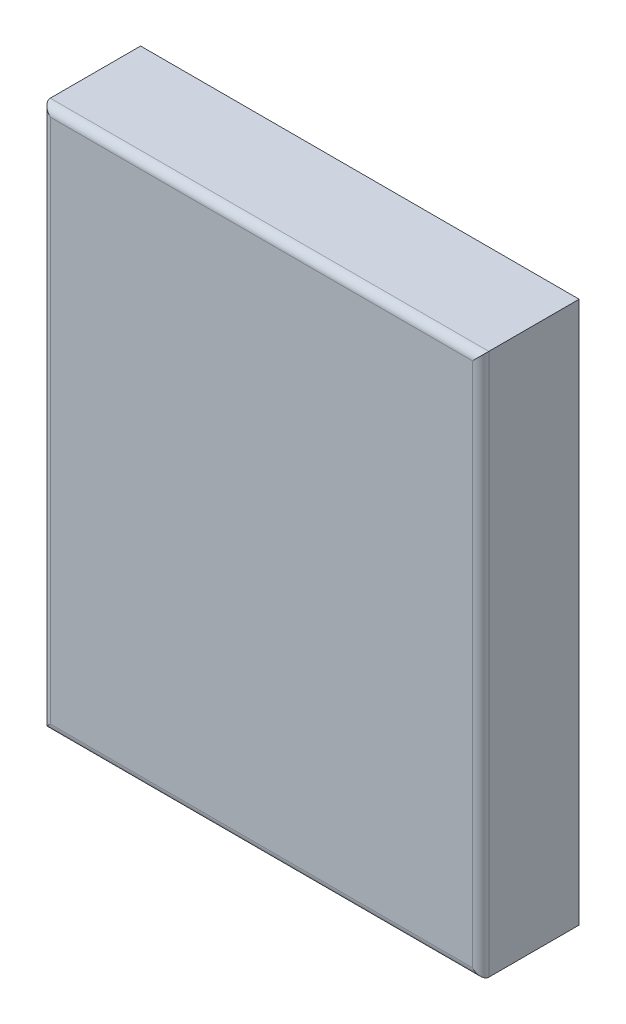
ISO-10303-21;
HEADER;
FILE_DESCRIPTION(('STEP AP214'),'2;1');
FILE_NAME('part.step','',(''),(''),'','','');
FILE_SCHEMA(('AUTOMOTIVE_DESIGN { 1 0 10303 214 1 1 1 1 }'));
ENDSEC;
DATA;
#1=APPLICATION_CONTEXT('core data for automotive mechanical design processes');
#2=APPLICATION_PROTOCOL_DEFINITION('international standard','automotive_design',2000,#1);
#3=PRODUCT_CONTEXT('',#1,'mechanical');
#4=PRODUCT('Part','Part','',(#3));
#5=PRODUCT_RELATED_PRODUCT_CATEGORY('part','',(#4));
#6=PRODUCT_DEFINITION_FORMATION('','',#4);
#7=PRODUCT_DEFINITION_CONTEXT('part definition',#1,'design');
#8=PRODUCT_DEFINITION('design','',#6,#7);
#9=PRODUCT_DEFINITION_SHAPE('','',#8);
#10=(LENGTH_UNIT() NAMED_UNIT(*) SI_UNIT(.MILLI.,.METRE.));
#11=(NAMED_UNIT(*) PLANE_ANGLE_UNIT() SI_UNIT($,.RADIAN.));
#12=(NAMED_UNIT(*) SI_UNIT($,.STERADIAN.) SOLID_ANGLE_UNIT());
#13=UNCERTAINTY_MEASURE_WITH_UNIT(LENGTH_MEASURE(1.E-05),#10,'distance_accuracy_value','');
#14=(GEOMETRIC_REPRESENTATION_CONTEXT(3) GLOBAL_UNCERTAINTY_ASSIGNED_CONTEXT((#13)) GLOBAL_UNIT_ASSIGNED_CONTEXT((#10,
#11,#12)) REPRESENTATION_CONTEXT('',''));
#15=CARTESIAN_POINT('',(0.,0.,0.));
#16=DIRECTION('',(0.,0.,1.));
#17=DIRECTION('',(1.,0.,0.));
#18=AXIS2_PLACEMENT_3D('',#15,#16,#17);
#19=CARTESIAN_POINT('',(55.00000122,70.5000006,3.));
#20=DIRECTION('',(0.,0.,-1.));
#21=DIRECTION('',(-1.,0.,0.));
#22=AXIS2_PLACEMENT_3D('',#19,#20,#21);
#23=PLANE('',#22);
#24=DIRECTION('',(-1.19248806385E-08,1.,0.));
#25=VECTOR('',#24,1.);
#26=CARTESIAN_POINT('',(53.7150012396762,68.850000584677,3.));
#27=LINE('',#26,#25);
#28=CARTESIAN_POINT('',(53.7150012390795,68.9000005846766,3.));
#29=VERTEX_POINT('',#28);
#30=CARTESIAN_POINT('',(53.7150012009199,72.1000005846765,3.));
#31=VERTEX_POINT('',#30);
#32=EDGE_CURVE('E87',#29,#31,#27,.T.);
#33=ORIENTED_EDGE('',*,*,#32,.F.);
#34=DIRECTION('',(-1.,-1.19248806385E-08,0.));
#35=VECTOR('',#34,1.);
#36=CARTESIAN_POINT('',(56.33500123908,68.9000006159192,3.));
#37=LINE('',#36,#35);
#38=CARTESIAN_POINT('',(56.2850012390801,68.9000006153235,3.));
#39=VERTEX_POINT('',#38);
#40=EDGE_CURVE('E79',#39,#29,#37,.T.);
#41=ORIENTED_EDGE('',*,*,#40,.F.);
#42=DIRECTION('',(1.19248806385E-08,-1.,0.));
#43=VECTOR('',#42,1.);
#44=CARTESIAN_POINT('',(56.2850012003238,72.150000615323,3.));
#45=LINE('',#44,#43);
#46=CARTESIAN_POINT('',(56.2850012009205,72.1000006153235,3.));
#47=VERTEX_POINT('',#46);
#48=EDGE_CURVE('E76',#47,#39,#45,.T.);
#49=ORIENTED_EDGE('',*,*,#48,.F.);
#50=DIRECTION('',(1.,1.19248806385E-08,0.));
#51=VECTOR('',#50,1.);
#52=CARTESIAN_POINT('',(53.66500120092,72.1000005840808,3.));
#53=LINE('',#52,#51);
#54=EDGE_CURVE('E67',#31,#47,#53,.T.);
#55=ORIENTED_EDGE('',*,*,#54,.F.);
#56=EDGE_LOOP('',(#33,#41,#49,#55));
#57=FACE_BOUND('',#56,.T.);
#58=ADVANCED_FACE('F17',(#57),#23,.F.);
#59=CARTESIAN_POINT('',(56.285001200324,72.150000615323,2.95));
#60=DIRECTION('',(1.19248806385E-08,-1.,0.));
#61=DIRECTION('',(1.,1.19248806385E-08,0.));
#62=AXIS2_PLACEMENT_3D('',#59,#60,#61);
#63=CYLINDRICAL_SURFACE('',#62,0.05);
#64=CARTESIAN_POINT('',(56.2850012390799,68.9000006153238,2.95));
#65=DIRECTION('',(-0.707106772754383,-0.707106789618711,0.));
#66=DIRECTION('',(-0.707106789618711,0.707106772754383,0.));
#67=AXIS2_PLACEMENT_3D('',#64,#65,#66);
#68=ELLIPSE('',#67,0.0707106781186548,0.05);
#69=CARTESIAN_POINT('',(56.3350012396761,68.85000061592,2.95));
#70=VERTEX_POINT('',#69);
#71=EDGE_CURVE('E91',#70,#39,#68,.T.);
#72=ORIENTED_EDGE('',*,*,#71,.F.);
#73=DIRECTION('',(-1.19248806385E-08,1.,0.));
#74=VECTOR('',#73,1.);
#75=CARTESIAN_POINT('',(56.335001200324,72.15000061592,2.95));
#76=LINE('',#75,#74);
#77=CARTESIAN_POINT('',(56.335001200324,72.1500006159194,2.95));
#78=VERTEX_POINT('',#77);
#79=EDGE_CURVE('E85',#78,#70,#76,.F.);
#80=ORIENTED_EDGE('',*,*,#79,.F.);
#81=CARTESIAN_POINT('',(56.2850012009202,72.1000006153232,2.95));
#82=DIRECTION('',(0.707106789618711,-0.707106772754383,0.));
#83=DIRECTION('',(0.707106772754383,0.707106789618711,0.));
#84=AXIS2_PLACEMENT_3D('',#81,#82,#83);
#85=ELLIPSE('',#84,0.0707106781186548,0.05);
#86=EDGE_CURVE('E20',#47,#78,#85,.F.);
#87=ORIENTED_EDGE('',*,*,#86,.F.);
#88=ORIENTED_EDGE('',*,*,#48,.T.);
#89=EDGE_LOOP('',(#72,#80,#87,#88));
#90=FACE_BOUND('',#89,.T.);
#91=ADVANCED_FACE('F84',(#90),#63,.T.);
#92=CARTESIAN_POINT('',(53.66500120092,72.10000058408,2.95));
#93=DIRECTION('',(1.,1.19248806385E-08,0.));
#94=DIRECTION('',(-1.19248806385E-08,1.,0.));
#95=AXIS2_PLACEMENT_3D('',#92,#93,#94);
#96=CYLINDRICAL_SURFACE('',#95,0.05);
#97=DIRECTION('',(-1.,-1.19248806385E-08,0.));
#98=VECTOR('',#97,1.);
#99=CARTESIAN_POINT('',(53.665001200324,72.15000058408,2.95));
#100=LINE('',#99,#98);
#101=CARTESIAN_POINT('',(53.6650012003239,72.15000058408,2.95));
#102=VERTEX_POINT('',#101);
#103=EDGE_CURVE('E99',#102,#78,#100,.F.);
#104=ORIENTED_EDGE('',*,*,#103,.F.);
#105=CARTESIAN_POINT('',(53.7150012009201,72.1000005846762,2.95));
#106=DIRECTION('',(0.707106772754383,0.707106789618711,0.));
#107=DIRECTION('',(-0.707106789618711,0.707106772754383,0.));
#108=AXIS2_PLACEMENT_3D('',#105,#106,#107);
#109=ELLIPSE('',#108,0.0707106781186548,0.05);
#110=EDGE_CURVE('E73',#31,#102,#109,.F.);
#111=ORIENTED_EDGE('',*,*,#110,.F.);
#112=ORIENTED_EDGE('',*,*,#54,.T.);
#113=ORIENTED_EDGE('',*,*,#86,.T.);
#114=EDGE_LOOP('',(#104,#111,#112,#113));
#115=FACE_BOUND('',#114,.T.);
#116=ADVANCED_FACE('F70',(#115),#96,.T.);
#117=CARTESIAN_POINT('',(53.715001239676,68.850000584677,2.95));
#118=DIRECTION('',(-1.19248806385E-08,1.,0.));
#119=DIRECTION('',(-1.,-1.19248806385E-08,0.));
#120=AXIS2_PLACEMENT_3D('',#117,#118,#119);
#121=CYLINDRICAL_SURFACE('',#120,0.05);
#122=DIRECTION('',(1.19248806385E-08,-1.,0.));
#123=VECTOR('',#122,1.);
#124=CARTESIAN_POINT('',(53.665001239676,68.85000058408,2.95));
#125=LINE('',#124,#123);
#126=CARTESIAN_POINT('',(53.665001239676,68.8500005840806,2.95));
#127=VERTEX_POINT('',#126);
#128=EDGE_CURVE('E98',#127,#102,#125,.F.);
#129=ORIENTED_EDGE('',*,*,#128,.F.);
#130=CARTESIAN_POINT('',(53.7150012390798,68.9000005846768,2.95));
#131=DIRECTION('',(-0.707106789618711,0.707106772754383,0.));
#132=DIRECTION('',(-0.707106772754383,-0.707106789618711,0.));
#133=AXIS2_PLACEMENT_3D('',#130,#131,#132);
#134=ELLIPSE('',#133,0.0707106781186548,0.05);
#135=EDGE_CURVE('E113',#29,#127,#134,.F.);
#136=ORIENTED_EDGE('',*,*,#135,.F.);
#137=ORIENTED_EDGE('',*,*,#32,.T.);
#138=ORIENTED_EDGE('',*,*,#110,.T.);
#139=EDGE_LOOP('',(#129,#136,#137,#138));
#140=FACE_BOUND('',#139,.T.);
#141=ADVANCED_FACE('F170',(#140),#121,.T.);
#142=CARTESIAN_POINT('',(56.33500123908,68.90000061592,2.95));
#143=DIRECTION('',(-1.,-1.19248806385E-08,0.));
#144=DIRECTION('',(1.19248806385E-08,-1.,0.));
#145=AXIS2_PLACEMENT_3D('',#142,#143,#144);
#146=CYLINDRICAL_SURFACE('',#145,0.05);
#147=ORIENTED_EDGE('',*,*,#135,.T.);
#148=DIRECTION('',(1.,1.19248806385E-08,0.));
#149=VECTOR('',#148,1.);
#150=CARTESIAN_POINT('',(56.335001239676,68.85000061592,2.95));
#151=LINE('',#150,#149);
#152=EDGE_CURVE('E122',#70,#127,#151,.F.);
#153=ORIENTED_EDGE('',*,*,#152,.F.);
#154=ORIENTED_EDGE('',*,*,#71,.T.);
#155=ORIENTED_EDGE('',*,*,#40,.T.);
#156=EDGE_LOOP('',(#147,#153,#154,#155));
#157=FACE_BOUND('',#156,.T.);
#158=ADVANCED_FACE('F167',(#157),#146,.T.);
#159=CARTESIAN_POINT('',(56.335001200324,72.15000061592,0.));
#160=DIRECTION('',(1.,1.19248806385E-08,0.));
#161=DIRECTION('',(-1.19248806385E-08,1.,0.));
#162=AXIS2_PLACEMENT_3D('',#159,#160,#161);
#163=PLANE('',#162);
#164=DIRECTION('',(0.,0.,1.));
#165=VECTOR('',#164,1.);
#166=CARTESIAN_POINT('',(56.335001200324,72.1500006159195,0.));
#167=LINE('',#166,#165);
#168=CARTESIAN_POINT('',(56.3350012167207,72.1500006159198,2.4));
#169=VERTEX_POINT('',#168);
#170=EDGE_CURVE('E103',#78,#169,#167,.F.);
#171=ORIENTED_EDGE('',*,*,#170,.F.);
#172=ORIENTED_EDGE('',*,*,#79,.T.);
#173=DIRECTION('',(0.,0.,1.));
#174=VECTOR('',#173,1.);
#175=CARTESIAN_POINT('',(56.335001239676,68.85000061592,0.));
#176=LINE('',#175,#174);
#177=CARTESIAN_POINT('',(56.335001239676,68.85000061592,2.4));
#178=VERTEX_POINT('',#177);
#179=EDGE_CURVE('E119',#178,#70,#176,.T.);
#180=ORIENTED_EDGE('',*,*,#179,.F.);
#181=DIRECTION('',(0.,1.,0.));
#182=VECTOR('',#181,1.);
#183=CARTESIAN_POINT('',(56.335001239676,72.390000643705,2.4));
#184=LINE('',#183,#182);
#185=EDGE_CURVE('E107',#178,#169,#184,.T.);
#186=ORIENTED_EDGE('',*,*,#185,.T.);
#187=EDGE_LOOP('',(#171,#172,#180,#186));
#188=FACE_BOUND('',#187,.T.);
#189=ADVANCED_FACE('F150',(#188),#163,.T.);
#190=CARTESIAN_POINT('',(53.665001200324,72.15000058408,0.));
#191=DIRECTION('',(-1.19248806385E-08,1.,0.));
#192=DIRECTION('',(-1.,-1.19248806385E-08,0.));
#193=AXIS2_PLACEMENT_3D('',#190,#191,#192);
#194=PLANE('',#193);
#195=DIRECTION('',(0.,0.,1.));
#196=VECTOR('',#195,1.);
#197=CARTESIAN_POINT('',(53.6650012003239,72.15000058408,0.));
#198=LINE('',#197,#196);
#199=CARTESIAN_POINT('',(53.6650012003239,72.15000058806,2.4));
#200=VERTEX_POINT('',#199);
#201=EDGE_CURVE('E96',#102,#200,#198,.F.);
#202=ORIENTED_EDGE('',*,*,#201,.F.);
#203=ORIENTED_EDGE('',*,*,#103,.T.);
#204=ORIENTED_EDGE('',*,*,#170,.T.);
#205=DIRECTION('',(1.,0.,0.));
#206=VECTOR('',#205,1.);
#207=CARTESIAN_POINT('',(58.665001197462,72.15000061592,2.4));
#208=LINE('',#207,#206);
#209=EDGE_CURVE('E104',#169,#200,#208,.F.);
#210=ORIENTED_EDGE('',*,*,#209,.T.);
#211=EDGE_LOOP('',(#202,#203,#204,#210));
#212=FACE_BOUND('',#211,.T.);
#213=ADVANCED_FACE('F147',(#212),#194,.T.);
#214=CARTESIAN_POINT('',(53.665001239676,68.85000058408,0.));
#215=DIRECTION('',(-1.,-1.19248806385E-08,0.));
#216=DIRECTION('',(1.19248806385E-08,-1.,0.));
#217=AXIS2_PLACEMENT_3D('',#214,#215,#216);
#218=PLANE('',#217);
#219=DIRECTION('',(0.,0.,1.));
#220=VECTOR('',#219,1.);
#221=CARTESIAN_POINT('',(53.665001239676,68.8500005840806,0.));
#222=LINE('',#221,#220);
#223=CARTESIAN_POINT('',(53.665001234757,68.8500005840803,2.4));
#224=VERTEX_POINT('',#223);
#225=EDGE_CURVE('E34',#127,#224,#222,.F.);
#226=ORIENTED_EDGE('',*,*,#225,.F.);
#227=ORIENTED_EDGE('',*,*,#128,.T.);
#228=ORIENTED_EDGE('',*,*,#201,.T.);
#229=DIRECTION('',(0.,1.,0.));
#230=VECTOR('',#229,1.);
#231=CARTESIAN_POINT('',(53.665001200324,72.390000643705,2.4));
#232=LINE('',#231,#230);
#233=EDGE_CURVE('E26',#200,#224,#232,.F.);
#234=ORIENTED_EDGE('',*,*,#233,.T.);
#235=EDGE_LOOP('',(#226,#227,#228,#234));
#236=FACE_BOUND('',#235,.T.);
#237=ADVANCED_FACE('F140',(#236),#218,.T.);
#238=CARTESIAN_POINT('',(56.335001239676,68.85000061592,0.));
#239=DIRECTION('',(1.19248806385E-08,-1.,0.));
#240=DIRECTION('',(1.,1.19248806385E-08,0.));
#241=AXIS2_PLACEMENT_3D('',#238,#239,#240);
#242=PLANE('',#241);
#243=ORIENTED_EDGE('',*,*,#179,.T.);
#244=ORIENTED_EDGE('',*,*,#152,.T.);
#245=ORIENTED_EDGE('',*,*,#225,.T.);
#246=DIRECTION('',(1.,0.,0.));
#247=VECTOR('',#246,1.);
#248=CARTESIAN_POINT('',(58.665001197462,68.85000058408,2.4));
#249=LINE('',#248,#247);
#250=EDGE_CURVE('E11',#224,#178,#249,.T.);
#251=ORIENTED_EDGE('',*,*,#250,.T.);
#252=EDGE_LOOP('',(#243,#244,#245,#251));
#253=FACE_BOUND('',#252,.T.);
#254=ADVANCED_FACE('F152',(#253),#242,.T.);
#255=CARTESIAN_POINT('',(58.665001197462,72.390000643705,2.4));
#256=DIRECTION('',(0.,0.,1.));
#257=DIRECTION('',(1.,0.,0.));
#258=AXIS2_PLACEMENT_3D('',#255,#256,#257);
#259=PLANE('',#258);
#260=ORIENTED_EDGE('',*,*,#233,.F.);
#261=ORIENTED_EDGE('',*,*,#209,.F.);
#262=ORIENTED_EDGE('',*,*,#185,.F.);
#263=ORIENTED_EDGE('',*,*,#250,.F.);
#264=EDGE_LOOP('',(#260,#261,#262,#263));
#265=FACE_BOUND('',#264,.T.);
#266=ADVANCED_FACE('F144',(#265),#259,.F.);
#267=CLOSED_SHELL('',(#58,#91,#116,#141,#158,#189,#213,#237,#254,#266));
#268=MANIFOLD_SOLID_BREP('B1',#267);
#269=ADVANCED_BREP_SHAPE_REPRESENTATION('',(#18,#268),#14);
#270=SHAPE_DEFINITION_REPRESENTATION(#9,#269);
ENDSEC;
END-ISO-10303-21;
